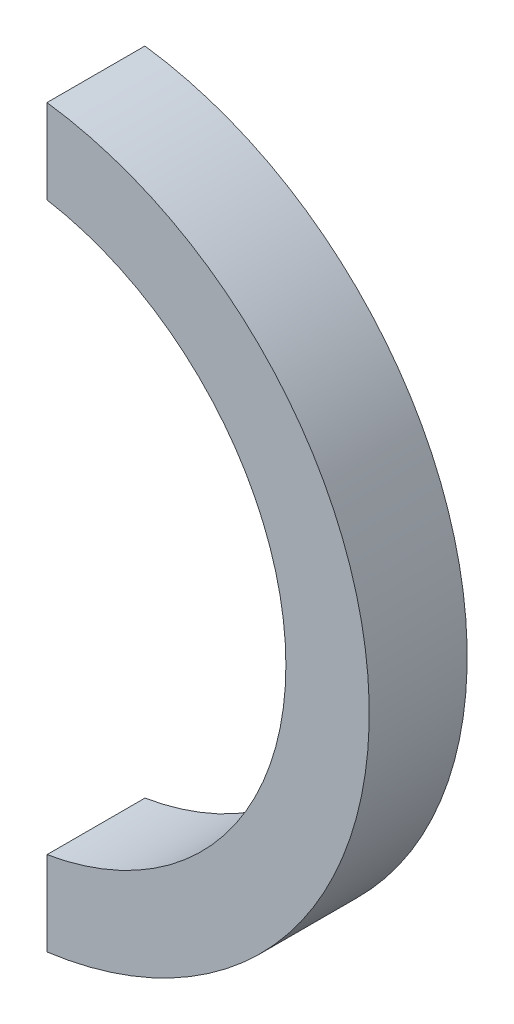
ISO-10303-21;
HEADER;
FILE_DESCRIPTION(('STEP AP214'),'2;1');
FILE_NAME('part.step','',(''),(''),'','','');
FILE_SCHEMA(('AUTOMOTIVE_DESIGN { 1 0 10303 214 1 1 1 1 }'));
ENDSEC;
DATA;
#1=APPLICATION_CONTEXT('core data for automotive mechanical design processes');
#2=APPLICATION_PROTOCOL_DEFINITION('international standard','automotive_design',2000,#1);
#3=PRODUCT_CONTEXT('',#1,'mechanical');
#4=PRODUCT('Part','Part','',(#3));
#5=PRODUCT_RELATED_PRODUCT_CATEGORY('part','',(#4));
#6=PRODUCT_DEFINITION_FORMATION('','',#4);
#7=PRODUCT_DEFINITION_CONTEXT('part definition',#1,'design');
#8=PRODUCT_DEFINITION('design','',#6,#7);
#9=PRODUCT_DEFINITION_SHAPE('','',#8);
#10=(LENGTH_UNIT() NAMED_UNIT(*) SI_UNIT(.MILLI.,.METRE.));
#11=(NAMED_UNIT(*) PLANE_ANGLE_UNIT() SI_UNIT($,.RADIAN.));
#12=(NAMED_UNIT(*) SI_UNIT($,.STERADIAN.) SOLID_ANGLE_UNIT());
#13=UNCERTAINTY_MEASURE_WITH_UNIT(LENGTH_MEASURE(1.E-05),#10,'distance_accuracy_value','');
#14=(GEOMETRIC_REPRESENTATION_CONTEXT(3) GLOBAL_UNCERTAINTY_ASSIGNED_CONTEXT((#13)) GLOBAL_UNIT_ASSIGNED_CONTEXT((#10,
#11,#12)) REPRESENTATION_CONTEXT('',''));
#15=CARTESIAN_POINT('',(0.,0.,0.));
#16=DIRECTION('',(0.,0.,1.));
#17=DIRECTION('',(1.,0.,0.));
#18=AXIS2_PLACEMENT_3D('',#15,#16,#17);
#19=CARTESIAN_POINT('',(0.,0.,18.966));
#20=DIRECTION('',(0.,0.,-1.));
#21=DIRECTION('',(-1.,0.,0.));
#22=AXIS2_PLACEMENT_3D('',#19,#20,#21);
#23=CYLINDRICAL_SURFACE('',#22,55.704);
#24=CARTESIAN_POINT('',(0.,0.,0.));
#25=DIRECTION('',(0.,0.,-1.));
#26=DIRECTION('',(1.,0.,0.));
#27=AXIS2_PLACEMENT_3D('',#24,#25,#26);
#28=CIRCLE('',#27,55.704);
#29=CARTESIAN_POINT('',(9.43750000000002,54.8987177423116,0.));
#30=VERTEX_POINT('',#29);
#31=CARTESIAN_POINT('',(9.43750000000002,-54.8987177423116,0.));
#32=VERTEX_POINT('',#31);
#33=EDGE_CURVE('E96',#30,#32,#28,.T.);
#34=ORIENTED_EDGE('',*,*,#33,.T.);
#35=DIRECTION('',(0.,0.,-1.));
#36=VECTOR('',#35,1.);
#37=CARTESIAN_POINT('',(9.43750000000002,-54.8987177423116,18.966));
#38=LINE('',#37,#36);
#39=CARTESIAN_POINT('',(9.43750000000002,-54.8987177423116,18.966));
#40=VERTEX_POINT('',#39);
#41=EDGE_CURVE('E11',#40,#32,#38,.T.);
#42=ORIENTED_EDGE('',*,*,#41,.F.);
#43=CARTESIAN_POINT('',(0.,0.,18.966));
#44=DIRECTION('',(0.,0.,-1.));
#45=DIRECTION('',(1.,0.,0.));
#46=AXIS2_PLACEMENT_3D('',#43,#44,#45);
#47=CIRCLE('',#46,55.704);
#48=CARTESIAN_POINT('',(9.43750000000002,54.8987177423116,18.966));
#49=VERTEX_POINT('',#48);
#50=EDGE_CURVE('E84',#49,#40,#47,.T.);
#51=ORIENTED_EDGE('',*,*,#50,.F.);
#52=DIRECTION('',(0.,0.,-1.));
#53=VECTOR('',#52,1.);
#54=CARTESIAN_POINT('',(9.43750000000002,54.8987177423116,18.966));
#55=LINE('',#54,#53);
#56=EDGE_CURVE('E92',#49,#30,#55,.T.);
#57=ORIENTED_EDGE('',*,*,#56,.T.);
#58=EDGE_LOOP('',(#34,#42,#51,#57));
#59=FACE_BOUND('',#58,.T.);
#60=ADVANCED_FACE('F33',(#59),#23,.F.);
#61=CARTESIAN_POINT('',(9.43750000000002,-54.8987177423116,18.966));
#62=DIRECTION('',(1.,0.,0.));
#63=DIRECTION('',(0.,0.,-1.));
#64=AXIS2_PLACEMENT_3D('',#61,#62,#63);
#65=PLANE('',#64);
#66=DIRECTION('',(0.,-1.,0.));
#67=VECTOR('',#66,1.);
#68=CARTESIAN_POINT('',(9.43750000000002,-54.8987177423116,0.));
#69=LINE('',#68,#67);
#70=CARTESIAN_POINT('',(9.43750000000001,-71.2224516479881,0.));
#71=VERTEX_POINT('',#70);
#72=EDGE_CURVE('E88',#32,#71,#69,.T.);
#73=ORIENTED_EDGE('',*,*,#72,.T.);
#74=DIRECTION('',(0.,0.,-1.));
#75=VECTOR('',#74,1.);
#76=CARTESIAN_POINT('',(9.43750000000001,-71.2224516479881,18.966));
#77=LINE('',#76,#75);
#78=CARTESIAN_POINT('',(9.43750000000001,-71.2224516479881,18.966));
#79=VERTEX_POINT('',#78);
#80=EDGE_CURVE('E41',#79,#71,#77,.T.);
#81=ORIENTED_EDGE('',*,*,#80,.F.);
#82=DIRECTION('',(0.,-1.,0.));
#83=VECTOR('',#82,1.);
#84=CARTESIAN_POINT('',(9.43750000000002,-54.8987177423116,18.966));
#85=LINE('',#84,#83);
#86=EDGE_CURVE('E79',#40,#79,#85,.T.);
#87=ORIENTED_EDGE('',*,*,#86,.F.);
#88=ORIENTED_EDGE('',*,*,#41,.T.);
#89=EDGE_LOOP('',(#73,#81,#87,#88));
#90=FACE_BOUND('',#89,.T.);
#91=ADVANCED_FACE('F87',(#90),#65,.F.);
#92=CARTESIAN_POINT('',(0.,0.,18.966));
#93=DIRECTION('',(0.,0.,-1.));
#94=DIRECTION('',(-1.,0.,0.));
#95=AXIS2_PLACEMENT_3D('',#92,#93,#94);
#96=CYLINDRICAL_SURFACE('',#95,71.845);
#97=CARTESIAN_POINT('',(0.,0.,0.));
#98=DIRECTION('',(0.,0.,1.));
#99=DIRECTION('',(1.,0.,0.));
#100=AXIS2_PLACEMENT_3D('',#97,#98,#99);
#101=CIRCLE('',#100,71.845);
#102=CARTESIAN_POINT('',(9.43750000000002,71.2224516479881,0.));
#103=VERTEX_POINT('',#102);
#104=EDGE_CURVE('E66',#71,#103,#101,.T.);
#105=ORIENTED_EDGE('',*,*,#104,.T.);
#106=DIRECTION('',(0.,0.,-1.));
#107=VECTOR('',#106,1.);
#108=CARTESIAN_POINT('',(9.43750000000002,71.2224516479881,18.966));
#109=LINE('',#108,#107);
#110=CARTESIAN_POINT('',(9.43750000000002,71.2224516479881,18.966));
#111=VERTEX_POINT('',#110);
#112=EDGE_CURVE('E89',#111,#103,#109,.T.);
#113=ORIENTED_EDGE('',*,*,#112,.F.);
#114=CARTESIAN_POINT('',(0.,0.,18.966));
#115=DIRECTION('',(0.,0.,1.));
#116=DIRECTION('',(1.,0.,0.));
#117=AXIS2_PLACEMENT_3D('',#114,#115,#116);
#118=CIRCLE('',#117,71.845);
#119=EDGE_CURVE('E82',#79,#111,#118,.T.);
#120=ORIENTED_EDGE('',*,*,#119,.F.);
#121=ORIENTED_EDGE('',*,*,#80,.T.);
#122=EDGE_LOOP('',(#105,#113,#120,#121));
#123=FACE_BOUND('',#122,.T.);
#124=ADVANCED_FACE('F90',(#123),#96,.T.);
#125=CARTESIAN_POINT('',(9.43750000000002,54.8987177423116,18.966));
#126=DIRECTION('',(1.,0.,0.));
#127=DIRECTION('',(0.,0.,-1.));
#128=AXIS2_PLACEMENT_3D('',#125,#126,#127);
#129=PLANE('',#128);
#130=DIRECTION('',(0.,-1.,0.));
#131=VECTOR('',#130,1.);
#132=CARTESIAN_POINT('',(9.43750000000002,54.8987177423116,0.));
#133=LINE('',#132,#131);
#134=EDGE_CURVE('E72',#103,#30,#133,.T.);
#135=ORIENTED_EDGE('',*,*,#134,.T.);
#136=ORIENTED_EDGE('',*,*,#56,.F.);
#137=DIRECTION('',(0.,-1.,0.));
#138=VECTOR('',#137,1.);
#139=CARTESIAN_POINT('',(9.43750000000002,54.8987177423116,18.966));
#140=LINE('',#139,#138);
#141=EDGE_CURVE('E49',#111,#49,#140,.T.);
#142=ORIENTED_EDGE('',*,*,#141,.F.);
#143=ORIENTED_EDGE('',*,*,#112,.T.);
#144=EDGE_LOOP('',(#135,#136,#142,#143));
#145=FACE_BOUND('',#144,.T.);
#146=ADVANCED_FACE('F103',(#145),#129,.F.);
#147=CARTESIAN_POINT('',(0.,0.,18.966));
#148=DIRECTION('',(0.,0.,1.));
#149=DIRECTION('',(1.,0.,0.));
#150=AXIS2_PLACEMENT_3D('',#147,#148,#149);
#151=PLANE('',#150);
#152=ORIENTED_EDGE('',*,*,#50,.T.);
#153=ORIENTED_EDGE('',*,*,#86,.T.);
#154=ORIENTED_EDGE('',*,*,#119,.T.);
#155=ORIENTED_EDGE('',*,*,#141,.T.);
#156=EDGE_LOOP('',(#152,#153,#154,#155));
#157=FACE_BOUND('',#156,.T.);
#158=ADVANCED_FACE('F80',(#157),#151,.T.);
#159=CARTESIAN_POINT('',(0.,0.,0.));
#160=DIRECTION('',(0.,0.,1.));
#161=DIRECTION('',(1.,0.,0.));
#162=AXIS2_PLACEMENT_3D('',#159,#160,#161);
#163=PLANE('',#162);
#164=ORIENTED_EDGE('',*,*,#33,.F.);
#165=ORIENTED_EDGE('',*,*,#134,.F.);
#166=ORIENTED_EDGE('',*,*,#104,.F.);
#167=ORIENTED_EDGE('',*,*,#72,.F.);
#168=EDGE_LOOP('',(#164,#165,#166,#167));
#169=FACE_BOUND('',#168,.T.);
#170=ADVANCED_FACE('F106',(#169),#163,.F.);
#171=CLOSED_SHELL('',(#60,#91,#124,#146,#158,#170));
#172=MANIFOLD_SOLID_BREP('B2',#171);
#173=ADVANCED_BREP_SHAPE_REPRESENTATION('',(#18,#172),#14);
#174=SHAPE_DEFINITION_REPRESENTATION(#9,#173);
ENDSEC;
END-ISO-10303-21;
